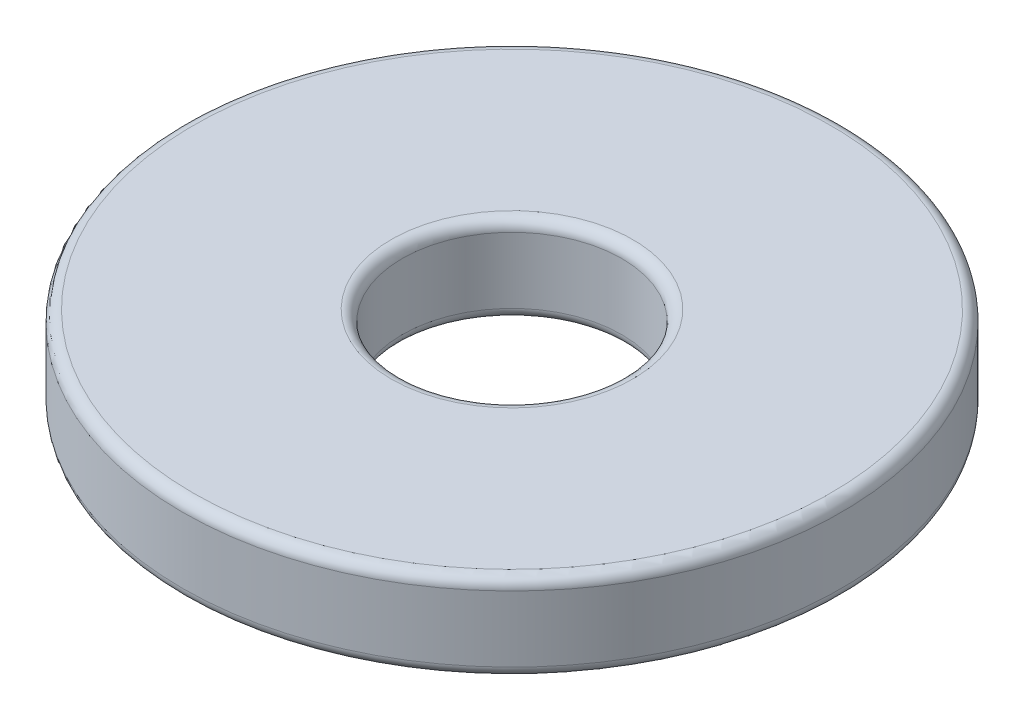
ISO-10303-21;
HEADER;
FILE_DESCRIPTION(('STEP AP214'),'2;1');
FILE_NAME('part.step','',(''),(''),'','','');
FILE_SCHEMA(('AUTOMOTIVE_DESIGN { 1 0 10303 214 1 1 1 1 }'));
ENDSEC;
DATA;
#1=APPLICATION_CONTEXT('core data for automotive mechanical design processes');
#2=APPLICATION_PROTOCOL_DEFINITION('international standard','automotive_design',2000,#1);
#3=PRODUCT_CONTEXT('',#1,'mechanical');
#4=PRODUCT('Part','Part','',(#3));
#5=PRODUCT_RELATED_PRODUCT_CATEGORY('part','',(#4));
#6=PRODUCT_DEFINITION_FORMATION('','',#4);
#7=PRODUCT_DEFINITION_CONTEXT('part definition',#1,'design');
#8=PRODUCT_DEFINITION('design','',#6,#7);
#9=PRODUCT_DEFINITION_SHAPE('','',#8);
#10=(LENGTH_UNIT() NAMED_UNIT(*) SI_UNIT(.MILLI.,.METRE.));
#11=(NAMED_UNIT(*) PLANE_ANGLE_UNIT() SI_UNIT($,.RADIAN.));
#12=(NAMED_UNIT(*) SI_UNIT($,.STERADIAN.) SOLID_ANGLE_UNIT());
#13=UNCERTAINTY_MEASURE_WITH_UNIT(LENGTH_MEASURE(1.E-05),#10,'distance_accuracy_value','');
#14=(GEOMETRIC_REPRESENTATION_CONTEXT(3) GLOBAL_UNCERTAINTY_ASSIGNED_CONTEXT((#13)) GLOBAL_UNIT_ASSIGNED_CONTEXT((#10,
#11,#12)) REPRESENTATION_CONTEXT('',''));
#15=CARTESIAN_POINT('',(0.,0.,0.));
#16=DIRECTION('',(0.,0.,1.));
#17=DIRECTION('',(1.,0.,0.));
#18=AXIS2_PLACEMENT_3D('',#15,#16,#17);
#19=CARTESIAN_POINT('',(0.,2.,0.));
#20=DIRECTION('',(0.,1.,0.));
#21=DIRECTION('',(0.,0.,1.));
#22=AXIS2_PLACEMENT_3D('',#19,#20,#21);
#23=PLANE('',#22);
#24=CARTESIAN_POINT('',(0.,2.,0.));
#25=DIRECTION('',(0.,1.,0.));
#26=DIRECTION('',(0.,0.,1.));
#27=AXIS2_PLACEMENT_3D('',#24,#25,#26);
#28=CIRCLE('',#27,2.75);
#29=CARTESIAN_POINT('',(0.,2.,2.75));
#30=VERTEX_POINT('',#29);
#31=EDGE_CURVE('E10',#30,#30,#28,.F.);
#32=ORIENTED_EDGE('',*,*,#31,.T.);
#33=EDGE_LOOP('',(#32));
#34=FACE_BOUND('',#33,.T.);
#35=CARTESIAN_POINT('',(0.,2.,0.));
#36=DIRECTION('',(0.,1.,0.));
#37=DIRECTION('',(0.,0.,1.));
#38=AXIS2_PLACEMENT_3D('',#35,#36,#37);
#39=CIRCLE('',#38,7.25);
#40=CARTESIAN_POINT('',(0.,2.,7.25));
#41=VERTEX_POINT('',#40);
#42=EDGE_CURVE('E43',#41,#41,#39,.T.);
#43=ORIENTED_EDGE('',*,*,#42,.T.);
#44=EDGE_LOOP('',(#43));
#45=FACE_BOUND('',#44,.T.);
#46=ADVANCED_FACE('F36',(#34,#45),#23,.T.);
#47=CARTESIAN_POINT('',(0.,0.,0.));
#48=DIRECTION('',(0.,1.,0.));
#49=DIRECTION('',(0.,0.,1.));
#50=AXIS2_PLACEMENT_3D('',#47,#48,#49);
#51=PLANE('',#50);
#52=CARTESIAN_POINT('',(0.,0.,0.));
#53=DIRECTION('',(0.,1.,0.));
#54=DIRECTION('',(0.,0.,1.));
#55=AXIS2_PLACEMENT_3D('',#52,#53,#54);
#56=CIRCLE('',#55,2.75);
#57=CARTESIAN_POINT('',(0.,0.,2.75));
#58=VERTEX_POINT('',#57);
#59=EDGE_CURVE('E62',#58,#58,#56,.T.);
#60=ORIENTED_EDGE('',*,*,#59,.T.);
#61=EDGE_LOOP('',(#60));
#62=FACE_BOUND('',#61,.T.);
#63=CARTESIAN_POINT('',(0.,0.,0.));
#64=DIRECTION('',(0.,1.,0.));
#65=DIRECTION('',(0.,0.,1.));
#66=AXIS2_PLACEMENT_3D('',#63,#64,#65);
#67=CIRCLE('',#66,7.25);
#68=CARTESIAN_POINT('',(0.,0.,7.25));
#69=VERTEX_POINT('',#68);
#70=EDGE_CURVE('E65',#69,#69,#67,.F.);
#71=ORIENTED_EDGE('',*,*,#70,.T.);
#72=EDGE_LOOP('',(#71));
#73=FACE_BOUND('',#72,.T.);
#74=ADVANCED_FACE('F69',(#62,#73),#51,.F.);
#75=CARTESIAN_POINT('',(0.,2.,0.));
#76=DIRECTION('',(0.,-1.,0.));
#77=DIRECTION('',(0.,0.,-1.));
#78=AXIS2_PLACEMENT_3D('',#75,#76,#77);
#79=CYLINDRICAL_SURFACE('',#78,7.5);
#80=CARTESIAN_POINT('',(0.,0.25,0.));
#81=DIRECTION('',(0.,1.,0.));
#82=DIRECTION('',(0.,0.,1.));
#83=AXIS2_PLACEMENT_3D('',#80,#81,#82);
#84=CIRCLE('',#83,7.5);
#85=CARTESIAN_POINT('',(0.,0.25,7.5));
#86=VERTEX_POINT('',#85);
#87=EDGE_CURVE('E47',#86,#86,#84,.T.);
#88=ORIENTED_EDGE('',*,*,#87,.T.);
#89=EDGE_LOOP('',(#88));
#90=FACE_BOUND('',#89,.T.);
#91=CARTESIAN_POINT('',(0.,1.75,0.));
#92=DIRECTION('',(0.,1.,0.));
#93=DIRECTION('',(0.,0.,1.));
#94=AXIS2_PLACEMENT_3D('',#91,#92,#93);
#95=CIRCLE('',#94,7.5);
#96=CARTESIAN_POINT('',(0.,1.75,7.5));
#97=VERTEX_POINT('',#96);
#98=EDGE_CURVE('E51',#97,#97,#95,.F.);
#99=ORIENTED_EDGE('',*,*,#98,.T.);
#100=EDGE_LOOP('',(#99));
#101=FACE_BOUND('',#100,.T.);
#102=ADVANCED_FACE('F79',(#90,#101),#79,.T.);
#103=CARTESIAN_POINT('',(0.,2.,0.));
#104=DIRECTION('',(0.,-1.,0.));
#105=DIRECTION('',(0.,0.,-1.));
#106=AXIS2_PLACEMENT_3D('',#103,#104,#105);
#107=CYLINDRICAL_SURFACE('',#106,2.5);
#108=CARTESIAN_POINT('',(0.,0.25,0.));
#109=DIRECTION('',(0.,1.,0.));
#110=DIRECTION('',(0.,0.,1.));
#111=AXIS2_PLACEMENT_3D('',#108,#109,#110);
#112=CIRCLE('',#111,2.5);
#113=CARTESIAN_POINT('',(0.,0.25,2.5));
#114=VERTEX_POINT('',#113);
#115=EDGE_CURVE('E56',#114,#114,#112,.F.);
#116=ORIENTED_EDGE('',*,*,#115,.T.);
#117=EDGE_LOOP('',(#116));
#118=FACE_BOUND('',#117,.T.);
#119=CARTESIAN_POINT('',(0.,1.75,0.));
#120=DIRECTION('',(0.,1.,0.));
#121=DIRECTION('',(0.,0.,1.));
#122=AXIS2_PLACEMENT_3D('',#119,#120,#121);
#123=CIRCLE('',#122,2.5);
#124=CARTESIAN_POINT('',(0.,1.75,2.5));
#125=VERTEX_POINT('',#124);
#126=EDGE_CURVE('E59',#125,#125,#123,.T.);
#127=ORIENTED_EDGE('',*,*,#126,.T.);
#128=EDGE_LOOP('',(#127));
#129=FACE_BOUND('',#128,.T.);
#130=ADVANCED_FACE('F82',(#118,#129),#107,.F.);
#131=CARTESIAN_POINT('',(0.,0.25,0.));
#132=DIRECTION('',(0.,1.,0.));
#133=DIRECTION('',(0.,0.,1.));
#134=AXIS2_PLACEMENT_3D('',#131,#132,#133);
#135=TOROIDAL_SURFACE('',#134,2.75,0.25);
#136=ORIENTED_EDGE('',*,*,#115,.F.);
#137=EDGE_LOOP('',(#136));
#138=FACE_BOUND('',#137,.T.);
#139=ORIENTED_EDGE('',*,*,#59,.F.);
#140=EDGE_LOOP('',(#139));
#141=FACE_BOUND('',#140,.T.);
#142=ADVANCED_FACE('F75',(#138,#141),#135,.T.);
#143=CARTESIAN_POINT('',(0.,0.25,0.));
#144=DIRECTION('',(0.,1.,0.));
#145=DIRECTION('',(0.,0.,1.));
#146=AXIS2_PLACEMENT_3D('',#143,#144,#145);
#147=TOROIDAL_SURFACE('',#146,7.25,0.25);
#148=ORIENTED_EDGE('',*,*,#70,.F.);
#149=EDGE_LOOP('',(#148));
#150=FACE_BOUND('',#149,.T.);
#151=ORIENTED_EDGE('',*,*,#87,.F.);
#152=EDGE_LOOP('',(#151));
#153=FACE_BOUND('',#152,.T.);
#154=ADVANCED_FACE('F71',(#150,#153),#147,.T.);
#155=CARTESIAN_POINT('',(0.,1.75,0.));
#156=DIRECTION('',(0.,1.,0.));
#157=DIRECTION('',(0.,0.,1.));
#158=AXIS2_PLACEMENT_3D('',#155,#156,#157);
#159=TOROIDAL_SURFACE('',#158,2.75,0.25);
#160=ORIENTED_EDGE('',*,*,#31,.F.);
#161=EDGE_LOOP('',(#160));
#162=FACE_BOUND('',#161,.T.);
#163=ORIENTED_EDGE('',*,*,#126,.F.);
#164=EDGE_LOOP('',(#163));
#165=FACE_BOUND('',#164,.T.);
#166=ADVANCED_FACE('F74',(#162,#165),#159,.T.);
#167=CARTESIAN_POINT('',(0.,1.75,0.));
#168=DIRECTION('',(0.,1.,0.));
#169=DIRECTION('',(0.,0.,1.));
#170=AXIS2_PLACEMENT_3D('',#167,#168,#169);
#171=TOROIDAL_SURFACE('',#170,7.25,0.25);
#172=ORIENTED_EDGE('',*,*,#98,.F.);
#173=EDGE_LOOP('',(#172));
#174=FACE_BOUND('',#173,.T.);
#175=ORIENTED_EDGE('',*,*,#42,.F.);
#176=EDGE_LOOP('',(#175));
#177=FACE_BOUND('',#176,.T.);
#178=ADVANCED_FACE('F38',(#174,#177),#171,.T.);
#179=CLOSED_SHELL('',(#46,#74,#102,#130,#142,#154,#166,#178));
#180=MANIFOLD_SOLID_BREP('B2',#179);
#181=ADVANCED_BREP_SHAPE_REPRESENTATION('',(#18,#180),#14);
#182=SHAPE_DEFINITION_REPRESENTATION(#9,#181);
ENDSEC;
END-ISO-10303-21;
